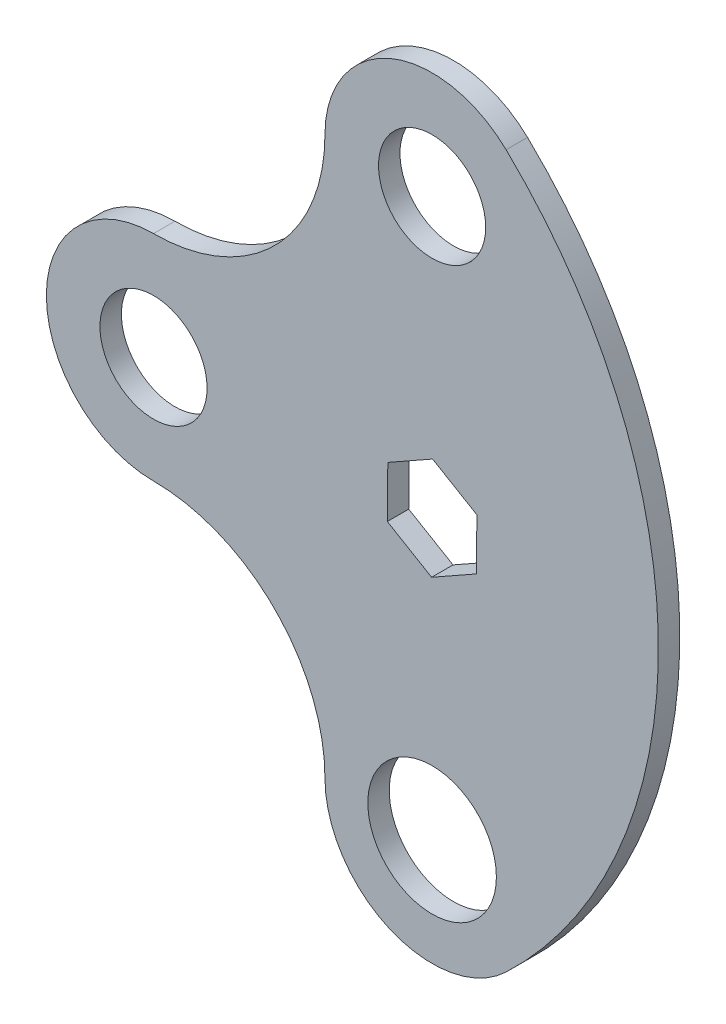
ISO-10303-21;
HEADER;
FILE_DESCRIPTION(('STEP AP214'),'2;1');
FILE_NAME('part.step','',(''),(''),'','','');
FILE_SCHEMA(('AUTOMOTIVE_DESIGN { 1 0 10303 214 1 1 1 1 }'));
ENDSEC;
DATA;
#1=APPLICATION_CONTEXT('core data for automotive mechanical design processes');
#2=APPLICATION_PROTOCOL_DEFINITION('international standard','automotive_design',2000,#1);
#3=PRODUCT_CONTEXT('',#1,'mechanical');
#4=PRODUCT('Part','Part','',(#3));
#5=PRODUCT_RELATED_PRODUCT_CATEGORY('part','',(#4));
#6=PRODUCT_DEFINITION_FORMATION('','',#4);
#7=PRODUCT_DEFINITION_CONTEXT('part definition',#1,'design');
#8=PRODUCT_DEFINITION('design','',#6,#7);
#9=PRODUCT_DEFINITION_SHAPE('','',#8);
#10=(LENGTH_UNIT() NAMED_UNIT(*) SI_UNIT(.MILLI.,.METRE.));
#11=(NAMED_UNIT(*) PLANE_ANGLE_UNIT() SI_UNIT($,.RADIAN.));
#12=(NAMED_UNIT(*) SI_UNIT($,.STERADIAN.) SOLID_ANGLE_UNIT());
#13=UNCERTAINTY_MEASURE_WITH_UNIT(LENGTH_MEASURE(1.E-05),#10,'distance_accuracy_value','');
#14=(GEOMETRIC_REPRESENTATION_CONTEXT(3) GLOBAL_UNCERTAINTY_ASSIGNED_CONTEXT((#13)) GLOBAL_UNIT_ASSIGNED_CONTEXT((#10,
#11,#12)) REPRESENTATION_CONTEXT('',''));
#15=CARTESIAN_POINT('',(0.,0.,0.));
#16=DIRECTION('',(0.,0.,1.));
#17=DIRECTION('',(1.,0.,0.));
#18=AXIS2_PLACEMENT_3D('',#15,#16,#17);
#19=CARTESIAN_POINT('',(0.,-32.5,5.));
#20=DIRECTION('',(0.,0.,1.));
#21=DIRECTION('',(1.,0.,0.));
#22=AXIS2_PLACEMENT_3D('',#19,#20,#21);
#23=PLANE('',#22);
#24=CARTESIAN_POINT('',(64.9999999999999,64.9999999999902,5.));
#25=DIRECTION('',(0.,0.,1.));
#26=DIRECTION('',(1.,0.,0.));
#27=AXIS2_PLACEMENT_3D('',#24,#25,#26);
#28=CIRCLE('',#27,12.500000000003);
#29=CARTESIAN_POINT('',(77.5000000000029,64.9999999999902,5.));
#30=VERTEX_POINT('',#29);
#31=EDGE_CURVE('E179',#30,#30,#28,.T.);
#32=ORIENTED_EDGE('',*,*,#31,.F.);
#33=EDGE_LOOP('',(#32));
#34=FACE_BOUND('',#33,.T.);
#35=CARTESIAN_POINT('',(0.,-65.,5.));
#36=DIRECTION('',(0.,0.,-1.));
#37=DIRECTION('',(1.,0.,0.));
#38=AXIS2_PLACEMENT_3D('',#35,#36,#37);
#39=CIRCLE('',#38,40.);
#40=CARTESIAN_POINT('',(0.,-25.,5.));
#41=VERTEX_POINT('',#40);
#42=CARTESIAN_POINT('',(40.,-65.,5.));
#43=VERTEX_POINT('',#42);
#44=EDGE_CURVE('E191',#41,#43,#39,.T.);
#45=ORIENTED_EDGE('',*,*,#44,.T.);
#46=CARTESIAN_POINT('',(65.,-65.,5.));
#47=DIRECTION('',(0.,0.,1.));
#48=DIRECTION('',(1.,0.,0.));
#49=AXIS2_PLACEMENT_3D('',#46,#47,#48);
#50=CIRCLE('',#49,25.);
#51=CARTESIAN_POINT('',(82.2679080007195,-83.0781457367371,5.));
#52=VERTEX_POINT('',#51);
#53=EDGE_CURVE('E194',#43,#52,#50,.T.);
#54=ORIENTED_EDGE('',*,*,#53,.T.);
#55=CARTESIAN_POINT('',(2.91321099011344,0.,5.));
#56=DIRECTION('',(0.,0.,1.));
#57=DIRECTION('',(1.,0.,0.));
#58=AXIS2_PLACEMENT_3D('',#55,#56,#57);
#59=CIRCLE('',#58,114.887537342828);
#60=CARTESIAN_POINT('',(82.2679080007241,83.0781457367293,5.));
#61=VERTEX_POINT('',#60);
#62=EDGE_CURVE('E197',#52,#61,#59,.T.);
#63=ORIENTED_EDGE('',*,*,#62,.T.);
#64=CARTESIAN_POINT('',(64.9999999999999,64.9999999999902,5.));
#65=DIRECTION('',(0.,0.,1.));
#66=DIRECTION('',(1.,0.,0.));
#67=AXIS2_PLACEMENT_3D('',#64,#65,#66);
#68=CIRCLE('',#67,25.000000000005);
#69=CARTESIAN_POINT('',(39.9999999999989,65.,5.));
#70=VERTEX_POINT('',#69);
#71=EDGE_CURVE('E199',#61,#70,#68,.T.);
#72=ORIENTED_EDGE('',*,*,#71,.T.);
#73=CARTESIAN_POINT('',(0.,65.,5.));
#74=DIRECTION('',(0.,0.,-1.));
#75=DIRECTION('',(1.,0.,0.));
#76=AXIS2_PLACEMENT_3D('',#73,#74,#75);
#77=CIRCLE('',#76,39.9999999999989);
#78=CARTESIAN_POINT('',(0.,25.,5.));
#79=VERTEX_POINT('',#78);
#80=EDGE_CURVE('E201',#70,#79,#77,.T.);
#81=ORIENTED_EDGE('',*,*,#80,.T.);
#82=CARTESIAN_POINT('',(0.,0.,5.));
#83=DIRECTION('',(0.,0.,1.));
#84=DIRECTION('',(1.,0.,0.));
#85=AXIS2_PLACEMENT_3D('',#82,#83,#84);
#86=CIRCLE('',#85,25.);
#87=EDGE_CURVE('E203',#79,#41,#86,.T.);
#88=ORIENTED_EDGE('',*,*,#87,.T.);
#89=EDGE_LOOP('',(#45,#54,#63,#72,#81,#88));
#90=FACE_BOUND('',#89,.T.);
#91=CARTESIAN_POINT('',(0.,0.,5.));
#92=DIRECTION('',(0.,0.,1.));
#93=DIRECTION('',(1.,0.,0.));
#94=AXIS2_PLACEMENT_3D('',#91,#92,#93);
#95=CIRCLE('',#94,12.5);
#96=CARTESIAN_POINT('',(12.5,0.,5.));
#97=VERTEX_POINT('',#96);
#98=EDGE_CURVE('E185',#97,#97,#95,.T.);
#99=ORIENTED_EDGE('',*,*,#98,.F.);
#100=EDGE_LOOP('',(#99));
#101=FACE_BOUND('',#100,.T.);
#102=CARTESIAN_POINT('',(65.,-65.,5.));
#103=DIRECTION('',(0.,0.,1.));
#104=DIRECTION('',(1.,0.,0.));
#105=AXIS2_PLACEMENT_3D('',#102,#103,#104);
#106=CIRCLE('',#105,15.);
#107=CARTESIAN_POINT('',(80.,-65.,5.));
#108=VERTEX_POINT('',#107);
#109=EDGE_CURVE('E173',#108,#108,#106,.T.);
#110=ORIENTED_EDGE('',*,*,#109,.F.);
#111=EDGE_LOOP('',(#110));
#112=FACE_BOUND('',#111,.T.);
#113=DIRECTION('',(0.00948470729818356,0.999955019152096,0.));
#114=VECTOR('',#113,1.);
#115=CARTESIAN_POINT('',(75.3349291469405,-6.09829808452481,5.));
#116=LINE('',#115,#114);
#117=CARTESIAN_POINT('',(75.3349291469405,-6.09829808452481,5.));
#118=VERTEX_POINT('',#117);
#119=CARTESIAN_POINT('',(75.4487456345187,5.90116214530034,5.));
#120=VERTEX_POINT('',#119);
#121=EDGE_CURVE('E130',#118,#120,#116,.T.);
#122=ORIENTED_EDGE('',*,*,#121,.F.);
#123=DIRECTION('',(0.870728802876561,0.491763512108361,0.));
#124=VECTOR('',#123,1.);
#125=CARTESIAN_POINT('',(64.8861835124218,-11.9994602298251,5.));
#126=LINE('',#125,#124);
#127=CARTESIAN_POINT('',(64.8861835124218,-11.9994602298251,5.));
#128=VERTEX_POINT('',#127);
#129=EDGE_CURVE('E122',#128,#118,#126,.T.);
#130=ORIENTED_EDGE('',*,*,#129,.F.);
#131=DIRECTION('',(0.861244095578378,-0.508191507043735,0.));
#132=VECTOR('',#131,1.);
#133=CARTESIAN_POINT('',(54.5512543654813,-5.90116214530033,5.));
#134=LINE('',#133,#132);
#135=CARTESIAN_POINT('',(54.5512543654813,-5.90116214530032,5.));
#136=VERTEX_POINT('',#135);
#137=EDGE_CURVE('E151',#136,#128,#134,.T.);
#138=ORIENTED_EDGE('',*,*,#137,.F.);
#139=DIRECTION('',(-0.00948470729818356,-0.999955019152096,0.));
#140=VECTOR('',#139,1.);
#141=CARTESIAN_POINT('',(54.6650708530595,6.09829808452482,5.));
#142=LINE('',#141,#140);
#143=CARTESIAN_POINT('',(54.6650708530595,6.09829808452482,5.));
#144=VERTEX_POINT('',#143);
#145=EDGE_CURVE('E149',#144,#136,#142,.T.);
#146=ORIENTED_EDGE('',*,*,#145,.F.);
#147=DIRECTION('',(-0.870728802876562,-0.491763512108361,0.));
#148=VECTOR('',#147,1.);
#149=CARTESIAN_POINT('',(65.1138164875782,11.9994602298252,5.));
#150=LINE('',#149,#148);
#151=CARTESIAN_POINT('',(65.1138164875782,11.9994602298252,5.));
#152=VERTEX_POINT('',#151);
#153=EDGE_CURVE('E145',#152,#144,#150,.T.);
#154=ORIENTED_EDGE('',*,*,#153,.F.);
#155=DIRECTION('',(-0.861244095578378,0.508191507043734,0.));
#156=VECTOR('',#155,1.);
#157=CARTESIAN_POINT('',(75.4487456345187,5.90116214530034,5.));
#158=LINE('',#157,#156);
#159=EDGE_CURVE('E143',#120,#152,#158,.T.);
#160=ORIENTED_EDGE('',*,*,#159,.F.);
#161=EDGE_LOOP('',(#122,#130,#138,#146,#154,#160));
#162=FACE_BOUND('',#161,.T.);
#163=ADVANCED_FACE('F33',(#34,#90,#101,#112,#162),#23,.T.);
#164=CARTESIAN_POINT('',(0.,-32.5,0.));
#165=DIRECTION('',(0.,0.,1.));
#166=DIRECTION('',(1.,0.,0.));
#167=AXIS2_PLACEMENT_3D('',#164,#165,#166);
#168=PLANE('',#167);
#169=CARTESIAN_POINT('',(65.,-65.,0.));
#170=DIRECTION('',(0.,0.,1.));
#171=DIRECTION('',(1.,0.,0.));
#172=AXIS2_PLACEMENT_3D('',#169,#170,#171);
#173=CIRCLE('',#172,15.);
#174=CARTESIAN_POINT('',(80.,-65.,0.));
#175=VERTEX_POINT('',#174);
#176=EDGE_CURVE('E138',#175,#175,#173,.T.);
#177=ORIENTED_EDGE('',*,*,#176,.T.);
#178=EDGE_LOOP('',(#177));
#179=FACE_BOUND('',#178,.T.);
#180=CARTESIAN_POINT('',(64.9999999999999,64.9999999999902,0.));
#181=DIRECTION('',(0.,0.,1.));
#182=DIRECTION('',(1.,0.,0.));
#183=AXIS2_PLACEMENT_3D('',#180,#181,#182);
#184=CIRCLE('',#183,12.500000000003);
#185=CARTESIAN_POINT('',(77.5000000000029,64.9999999999902,0.));
#186=VERTEX_POINT('',#185);
#187=EDGE_CURVE('E176',#186,#186,#184,.T.);
#188=ORIENTED_EDGE('',*,*,#187,.T.);
#189=EDGE_LOOP('',(#188));
#190=FACE_BOUND('',#189,.T.);
#191=CARTESIAN_POINT('',(0.,0.,0.));
#192=DIRECTION('',(0.,0.,1.));
#193=DIRECTION('',(1.,0.,0.));
#194=AXIS2_PLACEMENT_3D('',#191,#192,#193);
#195=CIRCLE('',#194,12.5);
#196=CARTESIAN_POINT('',(12.5,0.,0.));
#197=VERTEX_POINT('',#196);
#198=EDGE_CURVE('E182',#197,#197,#195,.T.);
#199=ORIENTED_EDGE('',*,*,#198,.T.);
#200=EDGE_LOOP('',(#199));
#201=FACE_BOUND('',#200,.T.);
#202=CARTESIAN_POINT('',(0.,-65.,0.));
#203=DIRECTION('',(0.,0.,-1.));
#204=DIRECTION('',(1.,0.,0.));
#205=AXIS2_PLACEMENT_3D('',#202,#203,#204);
#206=CIRCLE('',#205,40.);
#207=CARTESIAN_POINT('',(0.,-25.,0.));
#208=VERTEX_POINT('',#207);
#209=CARTESIAN_POINT('',(40.,-65.,0.));
#210=VERTEX_POINT('',#209);
#211=EDGE_CURVE('E188',#208,#210,#206,.T.);
#212=ORIENTED_EDGE('',*,*,#211,.F.);
#213=CARTESIAN_POINT('',(0.,0.,0.));
#214=DIRECTION('',(0.,0.,1.));
#215=DIRECTION('',(1.,0.,0.));
#216=AXIS2_PLACEMENT_3D('',#213,#214,#215);
#217=CIRCLE('',#216,25.);
#218=CARTESIAN_POINT('',(0.,25.,0.));
#219=VERTEX_POINT('',#218);
#220=EDGE_CURVE('E195',#219,#208,#217,.T.);
#221=ORIENTED_EDGE('',*,*,#220,.F.);
#222=CARTESIAN_POINT('',(0.,65.,0.));
#223=DIRECTION('',(0.,0.,-1.));
#224=DIRECTION('',(1.,0.,0.));
#225=AXIS2_PLACEMENT_3D('',#222,#223,#224);
#226=CIRCLE('',#225,39.9999999999989);
#227=CARTESIAN_POINT('',(39.9999999999989,65.,0.));
#228=VERTEX_POINT('',#227);
#229=EDGE_CURVE('E214',#228,#219,#226,.T.);
#230=ORIENTED_EDGE('',*,*,#229,.F.);
#231=CARTESIAN_POINT('',(64.9999999999999,64.9999999999902,0.));
#232=DIRECTION('',(0.,0.,1.));
#233=DIRECTION('',(1.,0.,0.));
#234=AXIS2_PLACEMENT_3D('',#231,#232,#233);
#235=CIRCLE('',#234,25.000000000005);
#236=CARTESIAN_POINT('',(82.2679080007241,83.0781457367293,0.));
#237=VERTEX_POINT('',#236);
#238=EDGE_CURVE('E212',#237,#228,#235,.T.);
#239=ORIENTED_EDGE('',*,*,#238,.F.);
#240=CARTESIAN_POINT('',(2.91321099011344,0.,0.));
#241=DIRECTION('',(0.,0.,1.));
#242=DIRECTION('',(1.,0.,0.));
#243=AXIS2_PLACEMENT_3D('',#240,#241,#242);
#244=CIRCLE('',#243,114.887537342828);
#245=CARTESIAN_POINT('',(82.2679080007195,-83.0781457367371,0.));
#246=VERTEX_POINT('',#245);
#247=EDGE_CURVE('E210',#246,#237,#244,.T.);
#248=ORIENTED_EDGE('',*,*,#247,.F.);
#249=CARTESIAN_POINT('',(65.,-65.,0.));
#250=DIRECTION('',(0.,0.,1.));
#251=DIRECTION('',(1.,0.,0.));
#252=AXIS2_PLACEMENT_3D('',#249,#250,#251);
#253=CIRCLE('',#252,25.);
#254=EDGE_CURVE('E208',#210,#246,#253,.T.);
#255=ORIENTED_EDGE('',*,*,#254,.F.);
#256=EDGE_LOOP('',(#212,#221,#230,#239,#248,#255));
#257=FACE_BOUND('',#256,.T.);
#258=DIRECTION('',(0.870728802876561,0.491763512108361,0.));
#259=VECTOR('',#258,1.);
#260=CARTESIAN_POINT('',(64.8861835124218,-11.9994602298251,0.));
#261=LINE('',#260,#259);
#262=CARTESIAN_POINT('',(64.8861835124218,-11.9994602298251,0.));
#263=VERTEX_POINT('',#262);
#264=CARTESIAN_POINT('',(75.3349291469405,-6.09829808452481,0.));
#265=VERTEX_POINT('',#264);
#266=EDGE_CURVE('E56',#263,#265,#261,.T.);
#267=ORIENTED_EDGE('',*,*,#266,.T.);
#268=DIRECTION('',(0.00948470729818356,0.999955019152096,0.));
#269=VECTOR('',#268,1.);
#270=CARTESIAN_POINT('',(75.3349291469405,-6.09829808452481,0.));
#271=LINE('',#270,#269);
#272=CARTESIAN_POINT('',(75.4487456345187,5.90116214530034,0.));
#273=VERTEX_POINT('',#272);
#274=EDGE_CURVE('E137',#265,#273,#271,.T.);
#275=ORIENTED_EDGE('',*,*,#274,.T.);
#276=DIRECTION('',(-0.861244095578378,0.508191507043734,0.));
#277=VECTOR('',#276,1.);
#278=CARTESIAN_POINT('',(75.4487456345187,5.90116214530034,0.));
#279=LINE('',#278,#277);
#280=CARTESIAN_POINT('',(65.1138164875782,11.9994602298252,0.));
#281=VERTEX_POINT('',#280);
#282=EDGE_CURVE('E155',#273,#281,#279,.T.);
#283=ORIENTED_EDGE('',*,*,#282,.T.);
#284=DIRECTION('',(-0.870728802876562,-0.491763512108361,0.));
#285=VECTOR('',#284,1.);
#286=CARTESIAN_POINT('',(65.1138164875782,11.9994602298252,0.));
#287=LINE('',#286,#285);
#288=CARTESIAN_POINT('',(54.6650708530595,6.09829808452482,0.));
#289=VERTEX_POINT('',#288);
#290=EDGE_CURVE('E158',#281,#289,#287,.T.);
#291=ORIENTED_EDGE('',*,*,#290,.T.);
#292=DIRECTION('',(-0.00948470729818356,-0.999955019152096,0.));
#293=VECTOR('',#292,1.);
#294=CARTESIAN_POINT('',(54.6650708530595,6.09829808452482,0.));
#295=LINE('',#294,#293);
#296=CARTESIAN_POINT('',(54.5512543654813,-5.90116214530033,0.));
#297=VERTEX_POINT('',#296);
#298=EDGE_CURVE('E161',#289,#297,#295,.T.);
#299=ORIENTED_EDGE('',*,*,#298,.T.);
#300=DIRECTION('',(0.861244095578378,-0.508191507043735,0.));
#301=VECTOR('',#300,1.);
#302=CARTESIAN_POINT('',(54.5512543654813,-5.90116214530033,0.));
#303=LINE('',#302,#301);
#304=EDGE_CURVE('E131',#297,#263,#303,.T.);
#305=ORIENTED_EDGE('',*,*,#304,.T.);
#306=EDGE_LOOP('',(#267,#275,#283,#291,#299,#305));
#307=FACE_BOUND('',#306,.T.);
#308=ADVANCED_FACE('F238',(#179,#190,#201,#257,#307),#168,.F.);
#309=CARTESIAN_POINT('',(0.,-65.,5.));
#310=DIRECTION('',(0.,0.,-1.));
#311=DIRECTION('',(-1.,0.,0.));
#312=AXIS2_PLACEMENT_3D('',#309,#310,#311);
#313=CYLINDRICAL_SURFACE('',#312,40.);
#314=ORIENTED_EDGE('',*,*,#211,.T.);
#315=DIRECTION('',(0.,0.,-1.));
#316=VECTOR('',#315,1.);
#317=CARTESIAN_POINT('',(40.,-65.,5.));
#318=LINE('',#317,#316);
#319=EDGE_CURVE('E11',#43,#210,#318,.T.);
#320=ORIENTED_EDGE('',*,*,#319,.F.);
#321=ORIENTED_EDGE('',*,*,#44,.F.);
#322=DIRECTION('',(0.,0.,-1.));
#323=VECTOR('',#322,1.);
#324=CARTESIAN_POINT('',(0.,-25.,5.));
#325=LINE('',#324,#323);
#326=EDGE_CURVE('E205',#41,#208,#325,.T.);
#327=ORIENTED_EDGE('',*,*,#326,.T.);
#328=EDGE_LOOP('',(#314,#320,#321,#327));
#329=FACE_BOUND('',#328,.T.);
#330=ADVANCED_FACE('F35',(#329),#313,.F.);
#331=CARTESIAN_POINT('',(65.,-65.,5.));
#332=DIRECTION('',(0.,0.,-1.));
#333=DIRECTION('',(-1.,0.,0.));
#334=AXIS2_PLACEMENT_3D('',#331,#332,#333);
#335=CYLINDRICAL_SURFACE('',#334,25.);
#336=ORIENTED_EDGE('',*,*,#254,.T.);
#337=DIRECTION('',(0.,0.,-1.));
#338=VECTOR('',#337,1.);
#339=CARTESIAN_POINT('',(82.2679080007195,-83.0781457367371,5.));
#340=LINE('',#339,#338);
#341=EDGE_CURVE('E41',#52,#246,#340,.T.);
#342=ORIENTED_EDGE('',*,*,#341,.F.);
#343=ORIENTED_EDGE('',*,*,#53,.F.);
#344=ORIENTED_EDGE('',*,*,#319,.T.);
#345=EDGE_LOOP('',(#336,#342,#343,#344));
#346=FACE_BOUND('',#345,.T.);
#347=ADVANCED_FACE('F256',(#346),#335,.T.);
#348=CARTESIAN_POINT('',(2.91321099011344,0.,5.));
#349=DIRECTION('',(0.,0.,-1.));
#350=DIRECTION('',(-1.,0.,0.));
#351=AXIS2_PLACEMENT_3D('',#348,#349,#350);
#352=CYLINDRICAL_SURFACE('',#351,114.887537342828);
#353=ORIENTED_EDGE('',*,*,#247,.T.);
#354=DIRECTION('',(0.,0.,-1.));
#355=VECTOR('',#354,1.);
#356=CARTESIAN_POINT('',(82.2679080007241,83.0781457367293,5.));
#357=LINE('',#356,#355);
#358=EDGE_CURVE('E225',#61,#237,#357,.T.);
#359=ORIENTED_EDGE('',*,*,#358,.F.);
#360=ORIENTED_EDGE('',*,*,#62,.F.);
#361=ORIENTED_EDGE('',*,*,#341,.T.);
#362=EDGE_LOOP('',(#353,#359,#360,#361));
#363=FACE_BOUND('',#362,.T.);
#364=ADVANCED_FACE('F232',(#363),#352,.T.);
#365=CARTESIAN_POINT('',(64.9999999999999,64.9999999999902,5.));
#366=DIRECTION('',(0.,0.,-1.));
#367=DIRECTION('',(-1.,0.,0.));
#368=AXIS2_PLACEMENT_3D('',#365,#366,#367);
#369=CYLINDRICAL_SURFACE('',#368,25.000000000005);
#370=ORIENTED_EDGE('',*,*,#238,.T.);
#371=DIRECTION('',(0.,0.,-1.));
#372=VECTOR('',#371,1.);
#373=CARTESIAN_POINT('',(39.9999999999989,65.,5.));
#374=LINE('',#373,#372);
#375=EDGE_CURVE('E222',#70,#228,#374,.T.);
#376=ORIENTED_EDGE('',*,*,#375,.F.);
#377=ORIENTED_EDGE('',*,*,#71,.F.);
#378=ORIENTED_EDGE('',*,*,#358,.T.);
#379=EDGE_LOOP('',(#370,#376,#377,#378));
#380=FACE_BOUND('',#379,.T.);
#381=ADVANCED_FACE('F244',(#380),#369,.T.);
#382=CARTESIAN_POINT('',(0.,65.,5.));
#383=DIRECTION('',(0.,0.,-1.));
#384=DIRECTION('',(-1.,0.,0.));
#385=AXIS2_PLACEMENT_3D('',#382,#383,#384);
#386=CYLINDRICAL_SURFACE('',#385,39.9999999999989);
#387=ORIENTED_EDGE('',*,*,#229,.T.);
#388=DIRECTION('',(0.,0.,-1.));
#389=VECTOR('',#388,1.);
#390=CARTESIAN_POINT('',(0.,25.,5.));
#391=LINE('',#390,#389);
#392=EDGE_CURVE('E219',#79,#219,#391,.T.);
#393=ORIENTED_EDGE('',*,*,#392,.F.);
#394=ORIENTED_EDGE('',*,*,#80,.F.);
#395=ORIENTED_EDGE('',*,*,#375,.T.);
#396=EDGE_LOOP('',(#387,#393,#394,#395));
#397=FACE_BOUND('',#396,.T.);
#398=ADVANCED_FACE('F248',(#397),#386,.F.);
#399=CARTESIAN_POINT('',(0.,0.,5.));
#400=DIRECTION('',(0.,0.,-1.));
#401=DIRECTION('',(-1.,0.,0.));
#402=AXIS2_PLACEMENT_3D('',#399,#400,#401);
#403=CYLINDRICAL_SURFACE('',#402,25.);
#404=ORIENTED_EDGE('',*,*,#220,.T.);
#405=ORIENTED_EDGE('',*,*,#326,.F.);
#406=ORIENTED_EDGE('',*,*,#87,.F.);
#407=ORIENTED_EDGE('',*,*,#392,.T.);
#408=EDGE_LOOP('',(#404,#405,#406,#407));
#409=FACE_BOUND('',#408,.T.);
#410=ADVANCED_FACE('F259',(#409),#403,.T.);
#411=CARTESIAN_POINT('',(0.,0.,5.));
#412=DIRECTION('',(0.,0.,-1.));
#413=DIRECTION('',(-1.,0.,0.));
#414=AXIS2_PLACEMENT_3D('',#411,#412,#413);
#415=CYLINDRICAL_SURFACE('',#414,12.5);
#416=ORIENTED_EDGE('',*,*,#98,.T.);
#417=EDGE_LOOP('',(#416));
#418=FACE_BOUND('',#417,.T.);
#419=ORIENTED_EDGE('',*,*,#198,.F.);
#420=EDGE_LOOP('',(#419));
#421=FACE_BOUND('',#420,.T.);
#422=ADVANCED_FACE('F261',(#418,#421),#415,.F.);
#423=CARTESIAN_POINT('',(64.9999999999999,64.9999999999902,5.));
#424=DIRECTION('',(0.,0.,-1.));
#425=DIRECTION('',(-1.,0.,0.));
#426=AXIS2_PLACEMENT_3D('',#423,#424,#425);
#427=CYLINDRICAL_SURFACE('',#426,12.500000000003);
#428=ORIENTED_EDGE('',*,*,#31,.T.);
#429=EDGE_LOOP('',(#428));
#430=FACE_BOUND('',#429,.T.);
#431=ORIENTED_EDGE('',*,*,#187,.F.);
#432=EDGE_LOOP('',(#431));
#433=FACE_BOUND('',#432,.T.);
#434=ADVANCED_FACE('F267',(#430,#433),#427,.F.);
#435=CARTESIAN_POINT('',(65.,-65.,5.));
#436=DIRECTION('',(0.,0.,-1.));
#437=DIRECTION('',(-1.,0.,0.));
#438=AXIS2_PLACEMENT_3D('',#435,#436,#437);
#439=CYLINDRICAL_SURFACE('',#438,15.);
#440=ORIENTED_EDGE('',*,*,#109,.T.);
#441=EDGE_LOOP('',(#440));
#442=FACE_BOUND('',#441,.T.);
#443=ORIENTED_EDGE('',*,*,#176,.F.);
#444=EDGE_LOOP('',(#443));
#445=FACE_BOUND('',#444,.T.);
#446=ADVANCED_FACE('F283',(#442,#445),#439,.F.);
#447=CARTESIAN_POINT('',(64.8861835124218,-11.9994602298251,5.));
#448=DIRECTION('',(-0.491763512108361,0.870728802876561,0.));
#449=DIRECTION('',(-0.870728802876561,-0.491763512108361,0.));
#450=AXIS2_PLACEMENT_3D('',#447,#448,#449);
#451=PLANE('',#450);
#452=ORIENTED_EDGE('',*,*,#266,.F.);
#453=DIRECTION('',(0.,0.,-1.));
#454=VECTOR('',#453,1.);
#455=CARTESIAN_POINT('',(64.8861835124218,-11.9994602298251,5.));
#456=LINE('',#455,#454);
#457=EDGE_CURVE('E126',#128,#263,#456,.T.);
#458=ORIENTED_EDGE('',*,*,#457,.F.);
#459=ORIENTED_EDGE('',*,*,#129,.T.);
#460=DIRECTION('',(0.,0.,-1.));
#461=VECTOR('',#460,1.);
#462=CARTESIAN_POINT('',(75.3349291469405,-6.09829808452481,5.));
#463=LINE('',#462,#461);
#464=EDGE_CURVE('E125',#118,#265,#463,.T.);
#465=ORIENTED_EDGE('',*,*,#464,.T.);
#466=EDGE_LOOP('',(#452,#458,#459,#465));
#467=FACE_BOUND('',#466,.T.);
#468=ADVANCED_FACE('F124',(#467),#451,.T.);
#469=CARTESIAN_POINT('',(75.3349291469405,-6.09829808452481,5.));
#470=DIRECTION('',(-0.999955019152096,0.00948470729818356,0.));
#471=DIRECTION('',(-0.00948470729818356,-0.999955019152096,0.));
#472=AXIS2_PLACEMENT_3D('',#469,#470,#471);
#473=PLANE('',#472);
#474=ORIENTED_EDGE('',*,*,#274,.F.);
#475=ORIENTED_EDGE('',*,*,#464,.F.);
#476=ORIENTED_EDGE('',*,*,#121,.T.);
#477=DIRECTION('',(0.,0.,-1.));
#478=VECTOR('',#477,1.);
#479=CARTESIAN_POINT('',(75.4487456345187,5.90116214530034,5.));
#480=LINE('',#479,#478);
#481=EDGE_CURVE('E139',#120,#273,#480,.T.);
#482=ORIENTED_EDGE('',*,*,#481,.T.);
#483=EDGE_LOOP('',(#474,#475,#476,#482));
#484=FACE_BOUND('',#483,.T.);
#485=ADVANCED_FACE('F134',(#484),#473,.T.);
#486=CARTESIAN_POINT('',(75.4487456345187,5.90116214530034,5.));
#487=DIRECTION('',(-0.508191507043734,-0.861244095578378,0.));
#488=DIRECTION('',(0.861244095578378,-0.508191507043734,0.));
#489=AXIS2_PLACEMENT_3D('',#486,#487,#488);
#490=PLANE('',#489);
#491=ORIENTED_EDGE('',*,*,#282,.F.);
#492=ORIENTED_EDGE('',*,*,#481,.F.);
#493=ORIENTED_EDGE('',*,*,#159,.T.);
#494=DIRECTION('',(0.,0.,-1.));
#495=VECTOR('',#494,1.);
#496=CARTESIAN_POINT('',(65.1138164875782,11.9994602298252,5.));
#497=LINE('',#496,#495);
#498=EDGE_CURVE('E170',#152,#281,#497,.T.);
#499=ORIENTED_EDGE('',*,*,#498,.T.);
#500=EDGE_LOOP('',(#491,#492,#493,#499));
#501=FACE_BOUND('',#500,.T.);
#502=ADVANCED_FACE('F292',(#501),#490,.T.);
#503=CARTESIAN_POINT('',(65.1138164875782,11.9994602298252,5.));
#504=DIRECTION('',(0.491763512108361,-0.870728802876562,0.));
#505=DIRECTION('',(0.870728802876562,0.491763512108361,0.));
#506=AXIS2_PLACEMENT_3D('',#503,#504,#505);
#507=PLANE('',#506);
#508=ORIENTED_EDGE('',*,*,#290,.F.);
#509=ORIENTED_EDGE('',*,*,#498,.F.);
#510=ORIENTED_EDGE('',*,*,#153,.T.);
#511=DIRECTION('',(0.,0.,-1.));
#512=VECTOR('',#511,1.);
#513=CARTESIAN_POINT('',(54.6650708530595,6.09829808452482,5.));
#514=LINE('',#513,#512);
#515=EDGE_CURVE('E168',#144,#289,#514,.T.);
#516=ORIENTED_EDGE('',*,*,#515,.T.);
#517=EDGE_LOOP('',(#508,#509,#510,#516));
#518=FACE_BOUND('',#517,.T.);
#519=ADVANCED_FACE('F295',(#518),#507,.T.);
#520=CARTESIAN_POINT('',(54.6650708530595,6.09829808452482,5.));
#521=DIRECTION('',(0.999955019152096,-0.00948470729818356,0.));
#522=DIRECTION('',(0.00948470729818356,0.999955019152096,0.));
#523=AXIS2_PLACEMENT_3D('',#520,#521,#522);
#524=PLANE('',#523);
#525=ORIENTED_EDGE('',*,*,#298,.F.);
#526=ORIENTED_EDGE('',*,*,#515,.F.);
#527=ORIENTED_EDGE('',*,*,#145,.T.);
#528=DIRECTION('',(0.,0.,-1.));
#529=VECTOR('',#528,1.);
#530=CARTESIAN_POINT('',(54.5512543654813,-5.90116214530033,5.));
#531=LINE('',#530,#529);
#532=EDGE_CURVE('E48',#136,#297,#531,.T.);
#533=ORIENTED_EDGE('',*,*,#532,.T.);
#534=EDGE_LOOP('',(#525,#526,#527,#533));
#535=FACE_BOUND('',#534,.T.);
#536=ADVANCED_FACE('F299',(#535),#524,.T.);
#537=CARTESIAN_POINT('',(54.5512543654813,-5.90116214530033,5.));
#538=DIRECTION('',(0.508191507043735,0.861244095578378,0.));
#539=DIRECTION('',(-0.861244095578378,0.508191507043735,0.));
#540=AXIS2_PLACEMENT_3D('',#537,#538,#539);
#541=PLANE('',#540);
#542=ORIENTED_EDGE('',*,*,#304,.F.);
#543=ORIENTED_EDGE('',*,*,#532,.F.);
#544=ORIENTED_EDGE('',*,*,#137,.T.);
#545=ORIENTED_EDGE('',*,*,#457,.T.);
#546=EDGE_LOOP('',(#542,#543,#544,#545));
#547=FACE_BOUND('',#546,.T.);
#548=ADVANCED_FACE('F303',(#547),#541,.T.);
#549=CLOSED_SHELL('',(#163,#308,#330,#347,#364,#381,#398,#410,#422,#434,#446,#468,#485,#502,
#519,#536,#548));
#550=MANIFOLD_SOLID_BREP('B2',#549);
#551=ADVANCED_BREP_SHAPE_REPRESENTATION('',(#18,#550),#14);
#552=SHAPE_DEFINITION_REPRESENTATION(#9,#551);
ENDSEC;
END-ISO-10303-21;
